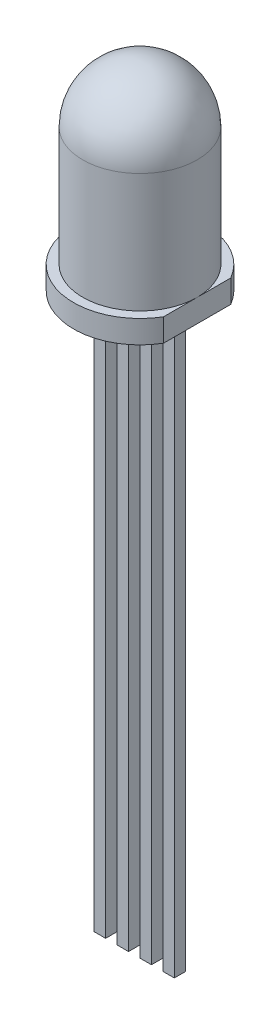
ISO-10303-21;
HEADER;
FILE_DESCRIPTION(('STEP AP214'),'2;1');
FILE_NAME('part.step','',(''),(''),'','','');
FILE_SCHEMA(('AUTOMOTIVE_DESIGN { 1 0 10303 214 1 1 1 1 }'));
ENDSEC;
DATA;
#1=APPLICATION_CONTEXT('core data for automotive mechanical design processes');
#2=APPLICATION_PROTOCOL_DEFINITION('international standard','automotive_design',2000,#1);
#3=PRODUCT_CONTEXT('',#1,'mechanical');
#4=PRODUCT('Part','Part','',(#3));
#5=PRODUCT_RELATED_PRODUCT_CATEGORY('part','',(#4));
#6=PRODUCT_DEFINITION_FORMATION('','',#4);
#7=PRODUCT_DEFINITION_CONTEXT('part definition',#1,'design');
#8=PRODUCT_DEFINITION('design','',#6,#7);
#9=PRODUCT_DEFINITION_SHAPE('','',#8);
#10=(LENGTH_UNIT() NAMED_UNIT(*) SI_UNIT(.MILLI.,.METRE.));
#11=(NAMED_UNIT(*) PLANE_ANGLE_UNIT() SI_UNIT($,.RADIAN.));
#12=(NAMED_UNIT(*) SI_UNIT($,.STERADIAN.) SOLID_ANGLE_UNIT());
#13=UNCERTAINTY_MEASURE_WITH_UNIT(LENGTH_MEASURE(1.E-05),#10,'distance_accuracy_value','');
#14=(GEOMETRIC_REPRESENTATION_CONTEXT(3) GLOBAL_UNCERTAINTY_ASSIGNED_CONTEXT((#13)) GLOBAL_UNIT_ASSIGNED_CONTEXT((#10,
#11,#12)) REPRESENTATION_CONTEXT('',''));
#15=CARTESIAN_POINT('',(0.,0.,0.));
#16=DIRECTION('',(0.,0.,1.));
#17=DIRECTION('',(1.,0.,0.));
#18=AXIS2_PLACEMENT_3D('',#15,#16,#17);
#19=CARTESIAN_POINT('',(0.,0.,0.));
#20=DIRECTION('',(0.,-1.,0.));
#21=DIRECTION('',(0.,0.,-1.));
#22=AXIS2_PLACEMENT_3D('',#19,#20,#21);
#23=PLANE('',#22);
#24=CARTESIAN_POINT('',(0.,0.,0.));
#25=DIRECTION('',(0.,-1.,0.));
#26=DIRECTION('',(0.,0.,-1.));
#27=AXIS2_PLACEMENT_3D('',#24,#25,#26);
#28=CIRCLE('',#27,2.9);
#29=CARTESIAN_POINT('',(2.5,0.,1.46969384566991));
#30=VERTEX_POINT('',#29);
#31=CARTESIAN_POINT('',(2.5,0.,-1.46969384566991));
#32=VERTEX_POINT('',#31);
#33=EDGE_CURVE('E11',#30,#32,#28,.T.);
#34=ORIENTED_EDGE('',*,*,#33,.T.);
#35=DIRECTION('',(0.,0.,1.));
#36=VECTOR('',#35,1.);
#37=CARTESIAN_POINT('',(2.5,0.,0.));
#38=LINE('',#37,#36);
#39=EDGE_CURVE('E331',#32,#30,#38,.T.);
#40=ORIENTED_EDGE('',*,*,#39,.T.);
#41=EDGE_LOOP('',(#34,#40));
#42=FACE_BOUND('',#41,.T.);
#43=DIRECTION('',(-1.,0.,0.));
#44=VECTOR('',#43,1.);
#45=CARTESIAN_POINT('',(-1.75,0.,0.250000008));
#46=LINE('',#45,#44);
#47=CARTESIAN_POINT('',(-1.25,0.,0.250000008));
#48=VERTEX_POINT('',#47);
#49=CARTESIAN_POINT('',(-1.75,0.,0.250000008));
#50=VERTEX_POINT('',#49);
#51=EDGE_CURVE('E309',#48,#50,#46,.T.);
#52=ORIENTED_EDGE('',*,*,#51,.F.);
#53=DIRECTION('',(0.,0.,1.));
#54=VECTOR('',#53,1.);
#55=CARTESIAN_POINT('',(-1.25,0.,0.250000008));
#56=LINE('',#55,#54);
#57=CARTESIAN_POINT('',(-1.25,0.,-0.250000008));
#58=VERTEX_POINT('',#57);
#59=EDGE_CURVE('E279',#58,#48,#56,.T.);
#60=ORIENTED_EDGE('',*,*,#59,.F.);
#61=DIRECTION('',(1.,0.,0.));
#62=VECTOR('',#61,1.);
#63=CARTESIAN_POINT('',(-1.75,0.,-0.250000008));
#64=LINE('',#63,#62);
#65=CARTESIAN_POINT('',(-1.75,0.,-0.250000008));
#66=VERTEX_POINT('',#65);
#67=EDGE_CURVE('E296',#66,#58,#64,.T.);
#68=ORIENTED_EDGE('',*,*,#67,.F.);
#69=DIRECTION('',(0.,0.,-1.));
#70=VECTOR('',#69,1.);
#71=CARTESIAN_POINT('',(-1.75,0.,0.250000008));
#72=LINE('',#71,#70);
#73=EDGE_CURVE('E312',#50,#66,#72,.T.);
#74=ORIENTED_EDGE('',*,*,#73,.F.);
#75=EDGE_LOOP('',(#52,#60,#68,#74));
#76=FACE_BOUND('',#75,.T.);
#77=DIRECTION('',(-1.,0.,0.));
#78=VECTOR('',#77,1.);
#79=CARTESIAN_POINT('',(-0.75,0.,0.250000008));
#80=LINE('',#79,#78);
#81=CARTESIAN_POINT('',(-0.25,0.,0.250000008));
#82=VERTEX_POINT('',#81);
#83=CARTESIAN_POINT('',(-0.75,0.,0.250000008));
#84=VERTEX_POINT('',#83);
#85=EDGE_CURVE('E272',#82,#84,#80,.T.);
#86=ORIENTED_EDGE('',*,*,#85,.F.);
#87=DIRECTION('',(0.,0.,1.));
#88=VECTOR('',#87,1.);
#89=CARTESIAN_POINT('',(-0.25,0.,0.250000008));
#90=LINE('',#89,#88);
#91=CARTESIAN_POINT('',(-0.25,0.,-0.250000008));
#92=VERTEX_POINT('',#91);
#93=EDGE_CURVE('E275',#92,#82,#90,.T.);
#94=ORIENTED_EDGE('',*,*,#93,.F.);
#95=DIRECTION('',(1.,0.,0.));
#96=VECTOR('',#95,1.);
#97=CARTESIAN_POINT('',(-0.75,0.,-0.250000008));
#98=LINE('',#97,#96);
#99=CARTESIAN_POINT('',(-0.75,0.,-0.250000008));
#100=VERTEX_POINT('',#99);
#101=EDGE_CURVE('E264',#100,#92,#98,.T.);
#102=ORIENTED_EDGE('',*,*,#101,.F.);
#103=DIRECTION('',(0.,0.,-1.));
#104=VECTOR('',#103,1.);
#105=CARTESIAN_POINT('',(-0.75,0.,0.250000008));
#106=LINE('',#105,#104);
#107=EDGE_CURVE('E267',#84,#100,#106,.T.);
#108=ORIENTED_EDGE('',*,*,#107,.F.);
#109=EDGE_LOOP('',(#86,#94,#102,#108));
#110=FACE_BOUND('',#109,.T.);
#111=DIRECTION('',(-1.,0.,0.));
#112=VECTOR('',#111,1.);
#113=CARTESIAN_POINT('',(0.25,0.,0.250000008));
#114=LINE('',#113,#112);
#115=CARTESIAN_POINT('',(0.75,0.,0.250000008));
#116=VERTEX_POINT('',#115);
#117=CARTESIAN_POINT('',(0.25,0.,0.250000008));
#118=VERTEX_POINT('',#117);
#119=EDGE_CURVE('E231',#116,#118,#114,.T.);
#120=ORIENTED_EDGE('',*,*,#119,.F.);
#121=DIRECTION('',(0.,0.,1.));
#122=VECTOR('',#121,1.);
#123=CARTESIAN_POINT('',(0.75,0.,0.250000008));
#124=LINE('',#123,#122);
#125=CARTESIAN_POINT('',(0.75,0.,-0.250000008));
#126=VERTEX_POINT('',#125);
#127=EDGE_CURVE('E234',#126,#116,#124,.T.);
#128=ORIENTED_EDGE('',*,*,#127,.F.);
#129=DIRECTION('',(1.,0.,0.));
#130=VECTOR('',#129,1.);
#131=CARTESIAN_POINT('',(0.25,0.,-0.250000008));
#132=LINE('',#131,#130);
#133=CARTESIAN_POINT('',(0.25,0.,-0.250000008));
#134=VERTEX_POINT('',#133);
#135=EDGE_CURVE('E224',#134,#126,#132,.T.);
#136=ORIENTED_EDGE('',*,*,#135,.F.);
#137=DIRECTION('',(0.,0.,-1.));
#138=VECTOR('',#137,1.);
#139=CARTESIAN_POINT('',(0.25,0.,0.250000008));
#140=LINE('',#139,#138);
#141=EDGE_CURVE('E227',#118,#134,#140,.T.);
#142=ORIENTED_EDGE('',*,*,#141,.F.);
#143=EDGE_LOOP('',(#120,#128,#136,#142));
#144=FACE_BOUND('',#143,.T.);
#145=DIRECTION('',(-1.,0.,0.));
#146=VECTOR('',#145,1.);
#147=CARTESIAN_POINT('',(1.25,0.,0.250000008));
#148=LINE('',#147,#146);
#149=CARTESIAN_POINT('',(1.75,0.,0.250000008));
#150=VERTEX_POINT('',#149);
#151=CARTESIAN_POINT('',(1.25,0.,0.250000008));
#152=VERTEX_POINT('',#151);
#153=EDGE_CURVE('E193',#150,#152,#148,.T.);
#154=ORIENTED_EDGE('',*,*,#153,.F.);
#155=DIRECTION('',(0.,0.,1.));
#156=VECTOR('',#155,1.);
#157=CARTESIAN_POINT('',(1.75,0.,0.250000008));
#158=LINE('',#157,#156);
#159=CARTESIAN_POINT('',(1.75,0.,-0.250000008));
#160=VERTEX_POINT('',#159);
#161=EDGE_CURVE('E187',#160,#150,#158,.T.);
#162=ORIENTED_EDGE('',*,*,#161,.F.);
#163=DIRECTION('',(1.,0.,0.));
#164=VECTOR('',#163,1.);
#165=CARTESIAN_POINT('',(1.25,0.,-0.250000008));
#166=LINE('',#165,#164);
#167=CARTESIAN_POINT('',(1.25,0.,-0.250000008));
#168=VERTEX_POINT('',#167);
#169=EDGE_CURVE('E171',#168,#160,#166,.T.);
#170=ORIENTED_EDGE('',*,*,#169,.F.);
#171=DIRECTION('',(0.,0.,-1.));
#172=VECTOR('',#171,1.);
#173=CARTESIAN_POINT('',(1.25,0.,0.250000008));
#174=LINE('',#173,#172);
#175=EDGE_CURVE('E180',#152,#168,#174,.T.);
#176=ORIENTED_EDGE('',*,*,#175,.F.);
#177=EDGE_LOOP('',(#154,#162,#170,#176));
#178=FACE_BOUND('',#177,.T.);
#179=ADVANCED_FACE('F42',(#42,#76,#110,#144,#178),#23,.T.);
#180=CARTESIAN_POINT('',(0.,0.,0.));
#181=DIRECTION('',(0.,-1.,0.));
#182=DIRECTION('',(0.,0.,-1.));
#183=AXIS2_PLACEMENT_3D('',#180,#181,#182);
#184=CYLINDRICAL_SURFACE('',#183,2.9);
#185=ORIENTED_EDGE('',*,*,#33,.F.);
#186=DIRECTION('',(0.,-1.,0.));
#187=VECTOR('',#186,1.);
#188=CARTESIAN_POINT('',(2.5,0.,1.46969384566991));
#189=LINE('',#188,#187);
#190=CARTESIAN_POINT('',(2.5,1.,1.46969384566991));
#191=VERTEX_POINT('',#190);
#192=EDGE_CURVE('E344',#30,#191,#189,.F.);
#193=ORIENTED_EDGE('',*,*,#192,.T.);
#194=CARTESIAN_POINT('',(0.,1.,0.));
#195=DIRECTION('',(0.,-1.,0.));
#196=DIRECTION('',(0.,0.,-1.));
#197=AXIS2_PLACEMENT_3D('',#194,#195,#196);
#198=CIRCLE('',#197,2.9);
#199=CARTESIAN_POINT('',(2.5,1.,-1.46969384566991));
#200=VERTEX_POINT('',#199);
#201=EDGE_CURVE('E50',#191,#200,#198,.T.);
#202=ORIENTED_EDGE('',*,*,#201,.T.);
#203=DIRECTION('',(0.,-1.,0.));
#204=VECTOR('',#203,1.);
#205=CARTESIAN_POINT('',(2.5,0.,-1.46969384566991));
#206=LINE('',#205,#204);
#207=EDGE_CURVE('E339',#200,#32,#206,.T.);
#208=ORIENTED_EDGE('',*,*,#207,.T.);
#209=EDGE_LOOP('',(#185,#193,#202,#208));
#210=FACE_BOUND('',#209,.T.);
#211=ADVANCED_FACE('F360',(#210),#184,.T.);
#212=CARTESIAN_POINT('',(2.5,1.,0.));
#213=DIRECTION('',(0.,1.,0.));
#214=DIRECTION('',(0.,0.,1.));
#215=AXIS2_PLACEMENT_3D('',#212,#213,#214);
#216=PLANE('',#215);
#217=ORIENTED_EDGE('',*,*,#201,.F.);
#218=DIRECTION('',(0.,0.,-1.));
#219=VECTOR('',#218,1.);
#220=CARTESIAN_POINT('',(2.5,1.,0.));
#221=LINE('',#220,#219);
#222=CARTESIAN_POINT('',(2.5,1.,0.));
#223=VERTEX_POINT('',#222);
#224=EDGE_CURVE('E340',#191,#223,#221,.T.);
#225=ORIENTED_EDGE('',*,*,#224,.T.);
#226=CARTESIAN_POINT('',(0.,1.,0.));
#227=DIRECTION('',(0.,-1.,0.));
#228=DIRECTION('',(0.,0.,-1.));
#229=AXIS2_PLACEMENT_3D('',#226,#227,#228);
#230=CIRCLE('',#229,2.5);
#231=EDGE_CURVE('E352',#223,#223,#230,.T.);
#232=ORIENTED_EDGE('',*,*,#231,.T.);
#233=EDGE_CURVE('E335',#223,#200,#221,.T.);
#234=ORIENTED_EDGE('',*,*,#233,.T.);
#235=EDGE_LOOP('',(#217,#225,#232,#234));
#236=FACE_BOUND('',#235,.T.);
#237=ADVANCED_FACE('F363',(#236),#216,.T.);
#238=CARTESIAN_POINT('',(0.,0.,0.));
#239=DIRECTION('',(0.,-1.,0.));
#240=DIRECTION('',(0.,0.,-1.));
#241=AXIS2_PLACEMENT_3D('',#238,#239,#240);
#242=CYLINDRICAL_SURFACE('',#241,2.5);
#243=CARTESIAN_POINT('',(0.,6.2,0.));
#244=DIRECTION('',(0.,-1.,0.));
#245=DIRECTION('',(0.,0.,-1.));
#246=AXIS2_PLACEMENT_3D('',#243,#244,#245);
#247=CIRCLE('',#246,2.5);
#248=CARTESIAN_POINT('',(0.,6.2,-2.5));
#249=VERTEX_POINT('',#248);
#250=EDGE_CURVE('E348',#249,#249,#247,.T.);
#251=ORIENTED_EDGE('',*,*,#250,.T.);
#252=EDGE_LOOP('',(#251));
#253=FACE_BOUND('',#252,.T.);
#254=ORIENTED_EDGE('',*,*,#231,.F.);
#255=EDGE_LOOP('',(#254));
#256=FACE_BOUND('',#255,.T.);
#257=ADVANCED_FACE('F451',(#253,#256),#242,.T.);
#258=CARTESIAN_POINT('',(0.,6.2,0.));
#259=DIRECTION('',(0.,-1.,0.));
#260=DIRECTION('',(1.,0.,0.));
#261=AXIS2_PLACEMENT_3D('',#258,#259,#260);
#262=SPHERICAL_SURFACE('',#261,2.5);
#263=ORIENTED_EDGE('',*,*,#250,.F.);
#264=EDGE_LOOP('',(#263));
#265=FACE_BOUND('',#264,.T.);
#266=ADVANCED_FACE('F448',(#265),#262,.T.);
#267=CARTESIAN_POINT('',(2.5,8.7,0.));
#268=DIRECTION('',(1.,0.,0.));
#269=DIRECTION('',(0.,0.,-1.));
#270=AXIS2_PLACEMENT_3D('',#267,#268,#269);
#271=PLANE('',#270);
#272=ORIENTED_EDGE('',*,*,#39,.F.);
#273=ORIENTED_EDGE('',*,*,#207,.F.);
#274=ORIENTED_EDGE('',*,*,#233,.F.);
#275=ORIENTED_EDGE('',*,*,#224,.F.);
#276=ORIENTED_EDGE('',*,*,#192,.F.);
#277=EDGE_LOOP('',(#272,#273,#274,#275,#276));
#278=FACE_BOUND('',#277,.T.);
#279=ADVANCED_FACE('F366',(#278),#271,.T.);
#280=CARTESIAN_POINT('',(-1.25,-25.,0.250000008));
#281=DIRECTION('',(-1.,0.,0.));
#282=DIRECTION('',(0.,0.,1.));
#283=AXIS2_PLACEMENT_3D('',#280,#281,#282);
#284=PLANE('',#283);
#285=ORIENTED_EDGE('',*,*,#59,.T.);
#286=DIRECTION('',(0.,1.,0.));
#287=VECTOR('',#286,1.);
#288=CARTESIAN_POINT('',(-1.25,-25.,0.250000008));
#289=LINE('',#288,#287);
#290=CARTESIAN_POINT('',(-1.25,-25.,0.250000008));
#291=VERTEX_POINT('',#290);
#292=EDGE_CURVE('E328',#291,#48,#289,.T.);
#293=ORIENTED_EDGE('',*,*,#292,.F.);
#294=DIRECTION('',(0.,0.,1.));
#295=VECTOR('',#294,1.);
#296=CARTESIAN_POINT('',(-1.25,-25.,0.250000008));
#297=LINE('',#296,#295);
#298=CARTESIAN_POINT('',(-1.25,-25.,-0.250000008));
#299=VERTEX_POINT('',#298);
#300=EDGE_CURVE('E291',#299,#291,#297,.T.);
#301=ORIENTED_EDGE('',*,*,#300,.F.);
#302=DIRECTION('',(0.,1.,0.));
#303=VECTOR('',#302,1.);
#304=CARTESIAN_POINT('',(-1.25,-25.,-0.250000008));
#305=LINE('',#304,#303);
#306=EDGE_CURVE('E305',#299,#58,#305,.T.);
#307=ORIENTED_EDGE('',*,*,#306,.T.);
#308=EDGE_LOOP('',(#285,#293,#301,#307));
#309=FACE_BOUND('',#308,.T.);
#310=ADVANCED_FACE('F441',(#309),#284,.F.);
#311=CARTESIAN_POINT('',(-1.75,-25.,0.250000008));
#312=DIRECTION('',(0.,0.,-1.));
#313=DIRECTION('',(-1.,0.,0.));
#314=AXIS2_PLACEMENT_3D('',#311,#312,#313);
#315=PLANE('',#314);
#316=ORIENTED_EDGE('',*,*,#51,.T.);
#317=DIRECTION('',(0.,1.,0.));
#318=VECTOR('',#317,1.);
#319=CARTESIAN_POINT('',(-1.75,-25.,0.250000008));
#320=LINE('',#319,#318);
#321=CARTESIAN_POINT('',(-1.75,-25.,0.250000008));
#322=VERTEX_POINT('',#321);
#323=EDGE_CURVE('E324',#322,#50,#320,.T.);
#324=ORIENTED_EDGE('',*,*,#323,.F.);
#325=DIRECTION('',(-1.,0.,0.));
#326=VECTOR('',#325,1.);
#327=CARTESIAN_POINT('',(-1.75,-25.,0.250000008));
#328=LINE('',#327,#326);
#329=EDGE_CURVE('E295',#291,#322,#328,.T.);
#330=ORIENTED_EDGE('',*,*,#329,.F.);
#331=ORIENTED_EDGE('',*,*,#292,.T.);
#332=EDGE_LOOP('',(#316,#324,#330,#331));
#333=FACE_BOUND('',#332,.T.);
#334=ADVANCED_FACE('F437',(#333),#315,.F.);
#335=CARTESIAN_POINT('',(-1.75,-25.,0.250000008));
#336=DIRECTION('',(1.,0.,0.));
#337=DIRECTION('',(0.,0.,-1.));
#338=AXIS2_PLACEMENT_3D('',#335,#336,#337);
#339=PLANE('',#338);
#340=ORIENTED_EDGE('',*,*,#73,.T.);
#341=DIRECTION('',(0.,1.,0.));
#342=VECTOR('',#341,1.);
#343=CARTESIAN_POINT('',(-1.75,-25.,-0.250000008));
#344=LINE('',#343,#342);
#345=CARTESIAN_POINT('',(-1.75,-25.,-0.250000008));
#346=VERTEX_POINT('',#345);
#347=EDGE_CURVE('E321',#346,#66,#344,.T.);
#348=ORIENTED_EDGE('',*,*,#347,.F.);
#349=DIRECTION('',(0.,0.,-1.));
#350=VECTOR('',#349,1.);
#351=CARTESIAN_POINT('',(-1.75,-25.,0.250000008));
#352=LINE('',#351,#350);
#353=EDGE_CURVE('E299',#322,#346,#352,.T.);
#354=ORIENTED_EDGE('',*,*,#353,.F.);
#355=ORIENTED_EDGE('',*,*,#323,.T.);
#356=EDGE_LOOP('',(#340,#348,#354,#355));
#357=FACE_BOUND('',#356,.T.);
#358=ADVANCED_FACE('F433',(#357),#339,.F.);
#359=CARTESIAN_POINT('',(-1.75,-25.,-0.250000008));
#360=DIRECTION('',(0.,0.,1.));
#361=DIRECTION('',(1.,0.,0.));
#362=AXIS2_PLACEMENT_3D('',#359,#360,#361);
#363=PLANE('',#362);
#364=ORIENTED_EDGE('',*,*,#67,.T.);
#365=ORIENTED_EDGE('',*,*,#306,.F.);
#366=DIRECTION('',(1.,0.,0.));
#367=VECTOR('',#366,1.);
#368=CARTESIAN_POINT('',(-1.75,-25.,-0.250000008));
#369=LINE('',#368,#367);
#370=EDGE_CURVE('E302',#346,#299,#369,.T.);
#371=ORIENTED_EDGE('',*,*,#370,.F.);
#372=ORIENTED_EDGE('',*,*,#347,.T.);
#373=EDGE_LOOP('',(#364,#365,#371,#372));
#374=FACE_BOUND('',#373,.T.);
#375=ADVANCED_FACE('F429',(#374),#363,.F.);
#376=CARTESIAN_POINT('',(0.,-25.,0.));
#377=DIRECTION('',(0.,-1.,0.));
#378=DIRECTION('',(0.,0.,-1.));
#379=AXIS2_PLACEMENT_3D('',#376,#377,#378);
#380=PLANE('',#379);
#381=ORIENTED_EDGE('',*,*,#300,.T.);
#382=ORIENTED_EDGE('',*,*,#329,.T.);
#383=ORIENTED_EDGE('',*,*,#353,.T.);
#384=ORIENTED_EDGE('',*,*,#370,.T.);
#385=EDGE_LOOP('',(#381,#382,#383,#384));
#386=FACE_BOUND('',#385,.T.);
#387=ADVANCED_FACE('F410',(#386),#380,.T.);
#388=CARTESIAN_POINT('',(-0.25,-25.,0.250000008));
#389=DIRECTION('',(-1.,0.,0.));
#390=DIRECTION('',(0.,0.,1.));
#391=AXIS2_PLACEMENT_3D('',#388,#389,#390);
#392=PLANE('',#391);
#393=ORIENTED_EDGE('',*,*,#93,.T.);
#394=DIRECTION('',(0.,1.,0.));
#395=VECTOR('',#394,1.);
#396=CARTESIAN_POINT('',(-0.25,-25.,0.250000008));
#397=LINE('',#396,#395);
#398=CARTESIAN_POINT('',(-0.25,-25.,0.250000008));
#399=VERTEX_POINT('',#398);
#400=EDGE_CURVE('E238',#399,#82,#397,.T.);
#401=ORIENTED_EDGE('',*,*,#400,.F.);
#402=DIRECTION('',(0.,0.,1.));
#403=VECTOR('',#402,1.);
#404=CARTESIAN_POINT('',(-0.25,-25.,0.250000008));
#405=LINE('',#404,#403);
#406=CARTESIAN_POINT('',(-0.25,-25.,-0.250000008));
#407=VERTEX_POINT('',#406);
#408=EDGE_CURVE('E268',#407,#399,#405,.T.);
#409=ORIENTED_EDGE('',*,*,#408,.F.);
#410=DIRECTION('',(0.,1.,0.));
#411=VECTOR('',#410,1.);
#412=CARTESIAN_POINT('',(-0.25,-25.,-0.250000008));
#413=LINE('',#412,#411);
#414=EDGE_CURVE('E259',#407,#92,#413,.T.);
#415=ORIENTED_EDGE('',*,*,#414,.T.);
#416=EDGE_LOOP('',(#393,#401,#409,#415));
#417=FACE_BOUND('',#416,.T.);
#418=ADVANCED_FACE('F406',(#417),#392,.F.);
#419=CARTESIAN_POINT('',(-0.75,-25.,0.250000008));
#420=DIRECTION('',(0.,0.,-1.));
#421=DIRECTION('',(-1.,0.,0.));
#422=AXIS2_PLACEMENT_3D('',#419,#420,#421);
#423=PLANE('',#422);
#424=ORIENTED_EDGE('',*,*,#85,.T.);
#425=DIRECTION('',(0.,1.,0.));
#426=VECTOR('',#425,1.);
#427=CARTESIAN_POINT('',(-0.75,-25.,0.250000008));
#428=LINE('',#427,#426);
#429=CARTESIAN_POINT('',(-0.75,-25.,0.250000008));
#430=VERTEX_POINT('',#429);
#431=EDGE_CURVE('E252',#430,#84,#428,.T.);
#432=ORIENTED_EDGE('',*,*,#431,.F.);
#433=DIRECTION('',(-1.,0.,0.));
#434=VECTOR('',#433,1.);
#435=CARTESIAN_POINT('',(-0.75,-25.,0.250000008));
#436=LINE('',#435,#434);
#437=EDGE_CURVE('E285',#399,#430,#436,.T.);
#438=ORIENTED_EDGE('',*,*,#437,.F.);
#439=ORIENTED_EDGE('',*,*,#400,.T.);
#440=EDGE_LOOP('',(#424,#432,#438,#439));
#441=FACE_BOUND('',#440,.T.);
#442=ADVANCED_FACE('F409',(#441),#423,.F.);
#443=CARTESIAN_POINT('',(-0.75,-25.,0.250000008));
#444=DIRECTION('',(1.,0.,0.));
#445=DIRECTION('',(0.,0.,-1.));
#446=AXIS2_PLACEMENT_3D('',#443,#444,#445);
#447=PLANE('',#446);
#448=ORIENTED_EDGE('',*,*,#107,.T.);
#449=DIRECTION('',(0.,1.,0.));
#450=VECTOR('',#449,1.);
#451=CARTESIAN_POINT('',(-0.75,-25.,-0.250000008));
#452=LINE('',#451,#450);
#453=CARTESIAN_POINT('',(-0.75,-25.,-0.250000008));
#454=VERTEX_POINT('',#453);
#455=EDGE_CURVE('E256',#454,#100,#452,.T.);
#456=ORIENTED_EDGE('',*,*,#455,.F.);
#457=DIRECTION('',(0.,0.,-1.));
#458=VECTOR('',#457,1.);
#459=CARTESIAN_POINT('',(-0.75,-25.,0.250000008));
#460=LINE('',#459,#458);
#461=EDGE_CURVE('E282',#430,#454,#460,.T.);
#462=ORIENTED_EDGE('',*,*,#461,.F.);
#463=ORIENTED_EDGE('',*,*,#431,.T.);
#464=EDGE_LOOP('',(#448,#456,#462,#463));
#465=FACE_BOUND('',#464,.T.);
#466=ADVANCED_FACE('F414',(#465),#447,.F.);
#467=CARTESIAN_POINT('',(-0.75,-25.,-0.250000008));
#468=DIRECTION('',(0.,0.,1.));
#469=DIRECTION('',(1.,0.,0.));
#470=AXIS2_PLACEMENT_3D('',#467,#468,#469);
#471=PLANE('',#470);
#472=ORIENTED_EDGE('',*,*,#101,.T.);
#473=ORIENTED_EDGE('',*,*,#414,.F.);
#474=DIRECTION('',(1.,0.,0.));
#475=VECTOR('',#474,1.);
#476=CARTESIAN_POINT('',(-0.75,-25.,-0.250000008));
#477=LINE('',#476,#475);
#478=EDGE_CURVE('E263',#454,#407,#477,.T.);
#479=ORIENTED_EDGE('',*,*,#478,.F.);
#480=ORIENTED_EDGE('',*,*,#455,.T.);
#481=EDGE_LOOP('',(#472,#473,#479,#480));
#482=FACE_BOUND('',#481,.T.);
#483=ADVANCED_FACE('F418',(#482),#471,.F.);
#484=CARTESIAN_POINT('',(0.,-25.,0.));
#485=DIRECTION('',(0.,-1.,0.));
#486=DIRECTION('',(0.,0.,-1.));
#487=AXIS2_PLACEMENT_3D('',#484,#485,#486);
#488=PLANE('',#487);
#489=ORIENTED_EDGE('',*,*,#408,.T.);
#490=ORIENTED_EDGE('',*,*,#437,.T.);
#491=ORIENTED_EDGE('',*,*,#461,.T.);
#492=ORIENTED_EDGE('',*,*,#478,.T.);
#493=EDGE_LOOP('',(#489,#490,#491,#492));
#494=FACE_BOUND('',#493,.T.);
#495=ADVANCED_FACE('F422',(#494),#488,.T.);
#496=CARTESIAN_POINT('',(0.75,-25.,0.250000008));
#497=DIRECTION('',(-1.,0.,0.));
#498=DIRECTION('',(0.,0.,1.));
#499=AXIS2_PLACEMENT_3D('',#496,#497,#498);
#500=PLANE('',#499);
#501=ORIENTED_EDGE('',*,*,#127,.T.);
#502=DIRECTION('',(0.,1.,0.));
#503=VECTOR('',#502,1.);
#504=CARTESIAN_POINT('',(0.75,-25.,0.250000008));
#505=LINE('',#504,#503);
#506=CARTESIAN_POINT('',(0.75,-25.,0.250000008));
#507=VERTEX_POINT('',#506);
#508=EDGE_CURVE('E195',#507,#116,#505,.T.);
#509=ORIENTED_EDGE('',*,*,#508,.F.);
#510=DIRECTION('',(0.,0.,1.));
#511=VECTOR('',#510,1.);
#512=CARTESIAN_POINT('',(0.75,-25.,0.250000008));
#513=LINE('',#512,#511);
#514=CARTESIAN_POINT('',(0.75,-25.,-0.250000008));
#515=VERTEX_POINT('',#514);
#516=EDGE_CURVE('E228',#515,#507,#513,.T.);
#517=ORIENTED_EDGE('',*,*,#516,.F.);
#518=DIRECTION('',(0.,1.,0.));
#519=VECTOR('',#518,1.);
#520=CARTESIAN_POINT('',(0.75,-25.,-0.250000008));
#521=LINE('',#520,#519);
#522=EDGE_CURVE('E219',#515,#126,#521,.T.);
#523=ORIENTED_EDGE('',*,*,#522,.T.);
#524=EDGE_LOOP('',(#501,#509,#517,#523));
#525=FACE_BOUND('',#524,.T.);
#526=ADVANCED_FACE('F394',(#525),#500,.F.);
#527=CARTESIAN_POINT('',(0.25,-25.,0.250000008));
#528=DIRECTION('',(0.,0.,-1.));
#529=DIRECTION('',(-1.,0.,0.));
#530=AXIS2_PLACEMENT_3D('',#527,#528,#529);
#531=PLANE('',#530);
#532=ORIENTED_EDGE('',*,*,#119,.T.);
#533=DIRECTION('',(0.,1.,0.));
#534=VECTOR('',#533,1.);
#535=CARTESIAN_POINT('',(0.25,-25.,0.250000008));
#536=LINE('',#535,#534);
#537=CARTESIAN_POINT('',(0.25,-25.,0.250000008));
#538=VERTEX_POINT('',#537);
#539=EDGE_CURVE('E199',#538,#118,#536,.T.);
#540=ORIENTED_EDGE('',*,*,#539,.F.);
#541=DIRECTION('',(-1.,0.,0.));
#542=VECTOR('',#541,1.);
#543=CARTESIAN_POINT('',(0.25,-25.,0.250000008));
#544=LINE('',#543,#542);
#545=EDGE_CURVE('E244',#507,#538,#544,.T.);
#546=ORIENTED_EDGE('',*,*,#545,.F.);
#547=ORIENTED_EDGE('',*,*,#508,.T.);
#548=EDGE_LOOP('',(#532,#540,#546,#547));
#549=FACE_BOUND('',#548,.T.);
#550=ADVANCED_FACE('F384',(#549),#531,.F.);
#551=CARTESIAN_POINT('',(0.25,-25.,0.250000008));
#552=DIRECTION('',(1.,0.,0.));
#553=DIRECTION('',(0.,0.,-1.));
#554=AXIS2_PLACEMENT_3D('',#551,#552,#553);
#555=PLANE('',#554);
#556=ORIENTED_EDGE('',*,*,#141,.T.);
#557=DIRECTION('',(0.,1.,0.));
#558=VECTOR('',#557,1.);
#559=CARTESIAN_POINT('',(0.25,-25.,-0.250000008));
#560=LINE('',#559,#558);
#561=CARTESIAN_POINT('',(0.25,-25.,-0.250000008));
#562=VERTEX_POINT('',#561);
#563=EDGE_CURVE('E65',#562,#134,#560,.T.);
#564=ORIENTED_EDGE('',*,*,#563,.F.);
#565=DIRECTION('',(0.,0.,-1.));
#566=VECTOR('',#565,1.);
#567=CARTESIAN_POINT('',(0.25,-25.,0.250000008));
#568=LINE('',#567,#566);
#569=EDGE_CURVE('E241',#538,#562,#568,.T.);
#570=ORIENTED_EDGE('',*,*,#569,.F.);
#571=ORIENTED_EDGE('',*,*,#539,.T.);
#572=EDGE_LOOP('',(#556,#564,#570,#571));
#573=FACE_BOUND('',#572,.T.);
#574=ADVANCED_FACE('F388',(#573),#555,.F.);
#575=CARTESIAN_POINT('',(0.25,-25.,-0.250000008));
#576=DIRECTION('',(0.,0.,1.));
#577=DIRECTION('',(1.,0.,0.));
#578=AXIS2_PLACEMENT_3D('',#575,#576,#577);
#579=PLANE('',#578);
#580=ORIENTED_EDGE('',*,*,#135,.T.);
#581=ORIENTED_EDGE('',*,*,#522,.F.);
#582=DIRECTION('',(1.,0.,0.));
#583=VECTOR('',#582,1.);
#584=CARTESIAN_POINT('',(0.25,-25.,-0.250000008));
#585=LINE('',#584,#583);
#586=EDGE_CURVE('E223',#562,#515,#585,.T.);
#587=ORIENTED_EDGE('',*,*,#586,.F.);
#588=ORIENTED_EDGE('',*,*,#563,.T.);
#589=EDGE_LOOP('',(#580,#581,#587,#588));
#590=FACE_BOUND('',#589,.T.);
#591=ADVANCED_FACE('F395',(#590),#579,.F.);
#592=CARTESIAN_POINT('',(0.,-25.,0.));
#593=DIRECTION('',(0.,-1.,0.));
#594=DIRECTION('',(0.,0.,-1.));
#595=AXIS2_PLACEMENT_3D('',#592,#593,#594);
#596=PLANE('',#595);
#597=ORIENTED_EDGE('',*,*,#516,.T.);
#598=ORIENTED_EDGE('',*,*,#545,.T.);
#599=ORIENTED_EDGE('',*,*,#569,.T.);
#600=ORIENTED_EDGE('',*,*,#586,.T.);
#601=EDGE_LOOP('',(#597,#598,#599,#600));
#602=FACE_BOUND('',#601,.T.);
#603=ADVANCED_FACE('F390',(#602),#596,.T.);
#604=CARTESIAN_POINT('',(1.75,-25.,0.250000008));
#605=DIRECTION('',(-1.,0.,0.));
#606=DIRECTION('',(0.,0.,1.));
#607=AXIS2_PLACEMENT_3D('',#604,#605,#606);
#608=PLANE('',#607);
#609=ORIENTED_EDGE('',*,*,#161,.T.);
#610=DIRECTION('',(0.,1.,0.));
#611=VECTOR('',#610,1.);
#612=CARTESIAN_POINT('',(1.75,-25.,0.250000008));
#613=LINE('',#612,#611);
#614=CARTESIAN_POINT('',(1.75,-25.,0.250000008));
#615=VERTEX_POINT('',#614);
#616=EDGE_CURVE('E687',#615,#150,#613,.T.);
#617=ORIENTED_EDGE('',*,*,#616,.F.);
#618=DIRECTION('',(0.,0.,1.));
#619=VECTOR('',#618,1.);
#620=CARTESIAN_POINT('',(1.75,-25.,0.250000008));
#621=LINE('',#620,#619);
#622=CARTESIAN_POINT('',(1.75,-25.,-0.250000008));
#623=VERTEX_POINT('',#622);
#624=EDGE_CURVE('E181',#623,#615,#621,.T.);
#625=ORIENTED_EDGE('',*,*,#624,.F.);
#626=DIRECTION('',(0.,1.,0.));
#627=VECTOR('',#626,1.);
#628=CARTESIAN_POINT('',(1.75,-25.,-0.250000008));
#629=LINE('',#628,#627);
#630=EDGE_CURVE('E174',#623,#160,#629,.T.);
#631=ORIENTED_EDGE('',*,*,#630,.T.);
#632=EDGE_LOOP('',(#609,#617,#625,#631));
#633=FACE_BOUND('',#632,.T.);
#634=ADVANCED_FACE('F185',(#633),#608,.F.);
#635=CARTESIAN_POINT('',(1.25,-25.,0.250000008));
#636=DIRECTION('',(0.,0.,-1.));
#637=DIRECTION('',(-1.,0.,0.));
#638=AXIS2_PLACEMENT_3D('',#635,#636,#637);
#639=PLANE('',#638);
#640=ORIENTED_EDGE('',*,*,#153,.T.);
#641=DIRECTION('',(0.,1.,0.));
#642=VECTOR('',#641,1.);
#643=CARTESIAN_POINT('',(1.25,-25.,0.250000008));
#644=LINE('',#643,#642);
#645=CARTESIAN_POINT('',(1.25,-25.,0.250000008));
#646=VERTEX_POINT('',#645);
#647=EDGE_CURVE('E689',#646,#152,#644,.T.);
#648=ORIENTED_EDGE('',*,*,#647,.F.);
#649=DIRECTION('',(-1.,0.,0.));
#650=VECTOR('',#649,1.);
#651=CARTESIAN_POINT('',(1.25,-25.,0.250000008));
#652=LINE('',#651,#650);
#653=EDGE_CURVE('E209',#615,#646,#652,.T.);
#654=ORIENTED_EDGE('',*,*,#653,.F.);
#655=ORIENTED_EDGE('',*,*,#616,.T.);
#656=EDGE_LOOP('',(#640,#648,#654,#655));
#657=FACE_BOUND('',#656,.T.);
#658=ADVANCED_FACE('F555',(#657),#639,.F.);
#659=CARTESIAN_POINT('',(1.25,-25.,0.250000008));
#660=DIRECTION('',(1.,0.,0.));
#661=DIRECTION('',(0.,0.,-1.));
#662=AXIS2_PLACEMENT_3D('',#659,#660,#661);
#663=PLANE('',#662);
#664=ORIENTED_EDGE('',*,*,#175,.T.);
#665=DIRECTION('',(0.,1.,0.));
#666=VECTOR('',#665,1.);
#667=CARTESIAN_POINT('',(1.25,-25.,-0.250000008));
#668=LINE('',#667,#666);
#669=CARTESIAN_POINT('',(1.25,-25.,-0.250000008));
#670=VERTEX_POINT('',#669);
#671=EDGE_CURVE('E57',#670,#168,#668,.T.);
#672=ORIENTED_EDGE('',*,*,#671,.F.);
#673=DIRECTION('',(0.,0.,-1.));
#674=VECTOR('',#673,1.);
#675=CARTESIAN_POINT('',(1.25,-25.,0.250000008));
#676=LINE('',#675,#674);
#677=EDGE_CURVE('E206',#646,#670,#676,.T.);
#678=ORIENTED_EDGE('',*,*,#677,.F.);
#679=ORIENTED_EDGE('',*,*,#647,.T.);
#680=EDGE_LOOP('',(#664,#672,#678,#679));
#681=FACE_BOUND('',#680,.T.);
#682=ADVANCED_FACE('F565',(#681),#663,.F.);
#683=CARTESIAN_POINT('',(1.25,-25.,-0.250000008));
#684=DIRECTION('',(0.,0.,1.));
#685=DIRECTION('',(1.,0.,0.));
#686=AXIS2_PLACEMENT_3D('',#683,#684,#685);
#687=PLANE('',#686);
#688=ORIENTED_EDGE('',*,*,#169,.T.);
#689=ORIENTED_EDGE('',*,*,#630,.F.);
#690=DIRECTION('',(1.,0.,0.));
#691=VECTOR('',#690,1.);
#692=CARTESIAN_POINT('',(1.25,-25.,-0.250000008));
#693=LINE('',#692,#691);
#694=EDGE_CURVE('E191',#670,#623,#693,.T.);
#695=ORIENTED_EDGE('',*,*,#694,.F.);
#696=ORIENTED_EDGE('',*,*,#671,.T.);
#697=EDGE_LOOP('',(#688,#689,#695,#696));
#698=FACE_BOUND('',#697,.T.);
#699=ADVANCED_FACE('F173',(#698),#687,.F.);
#700=CARTESIAN_POINT('',(0.,-25.,0.));
#701=DIRECTION('',(0.,-1.,0.));
#702=DIRECTION('',(0.,0.,-1.));
#703=AXIS2_PLACEMENT_3D('',#700,#701,#702);
#704=PLANE('',#703);
#705=ORIENTED_EDGE('',*,*,#624,.T.);
#706=ORIENTED_EDGE('',*,*,#653,.T.);
#707=ORIENTED_EDGE('',*,*,#677,.T.);
#708=ORIENTED_EDGE('',*,*,#694,.T.);
#709=EDGE_LOOP('',(#705,#706,#707,#708));
#710=FACE_BOUND('',#709,.T.);
#711=ADVANCED_FACE('F586',(#710),#704,.T.);
#712=CLOSED_SHELL('',(#179,#211,#237,#257,#266,#279,#310,#334,#358,#375,#387,#418,#442,#466,
#483,#495,#526,#550,#574,#591,#603,#634,#658,#682,#699,#711));
#713=MANIFOLD_SOLID_BREP('B2',#712);
#714=ADVANCED_BREP_SHAPE_REPRESENTATION('',(#18,#713),#14);
#715=SHAPE_DEFINITION_REPRESENTATION(#9,#714);
ENDSEC;
END-ISO-10303-21;
